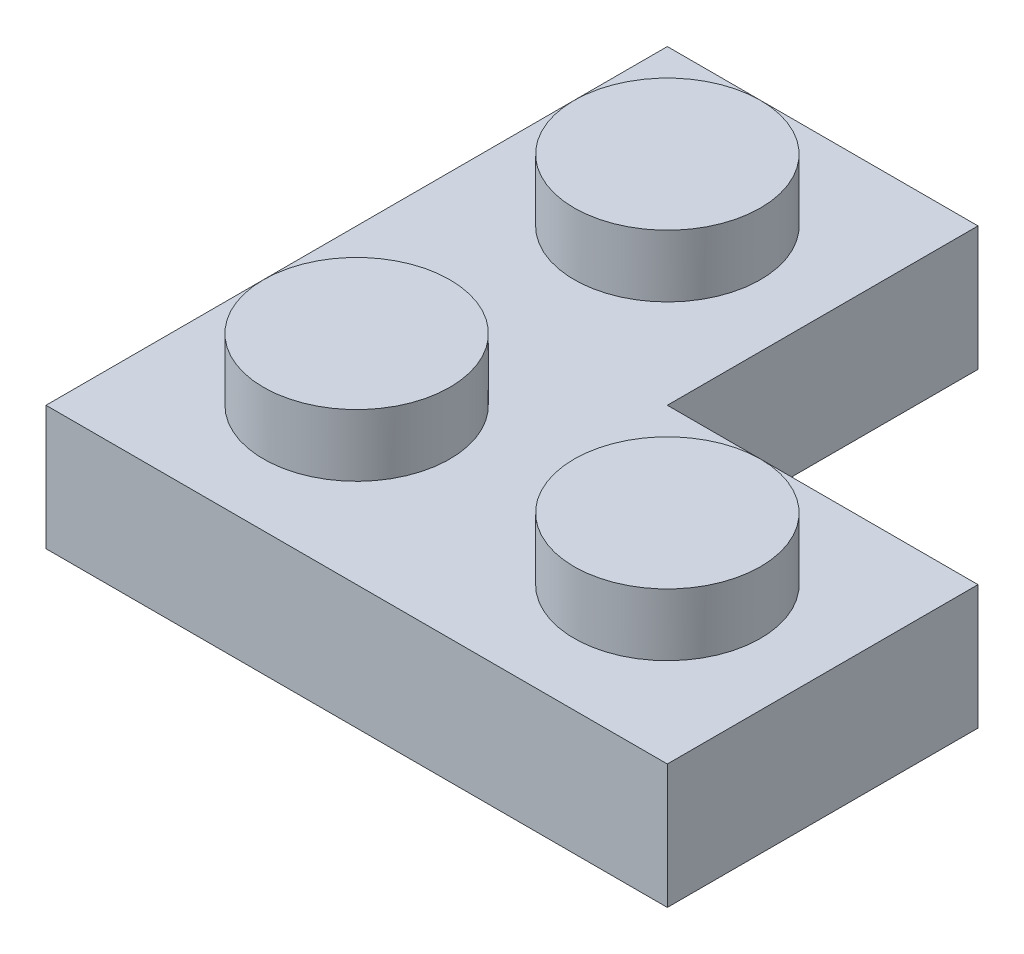
ISO-10303-21;
HEADER;
FILE_DESCRIPTION(('STEP AP214'),'2;1');
FILE_NAME('part.step','',(''),(''),'','','');
FILE_SCHEMA(('AUTOMOTIVE_DESIGN { 1 0 10303 214 1 1 1 1 }'));
ENDSEC;
DATA;
#1=APPLICATION_CONTEXT('core data for automotive mechanical design processes');
#2=APPLICATION_PROTOCOL_DEFINITION('international standard','automotive_design',2000,#1);
#3=PRODUCT_CONTEXT('',#1,'mechanical');
#4=PRODUCT('Part','Part','',(#3));
#5=PRODUCT_RELATED_PRODUCT_CATEGORY('part','',(#4));
#6=PRODUCT_DEFINITION_FORMATION('','',#4);
#7=PRODUCT_DEFINITION_CONTEXT('part definition',#1,'design');
#8=PRODUCT_DEFINITION('design','',#6,#7);
#9=PRODUCT_DEFINITION_SHAPE('','',#8);
#10=(LENGTH_UNIT() NAMED_UNIT(*) SI_UNIT(.MILLI.,.METRE.));
#11=(NAMED_UNIT(*) PLANE_ANGLE_UNIT() SI_UNIT($,.RADIAN.));
#12=(NAMED_UNIT(*) SI_UNIT($,.STERADIAN.) SOLID_ANGLE_UNIT());
#13=UNCERTAINTY_MEASURE_WITH_UNIT(LENGTH_MEASURE(1.E-05),#10,'distance_accuracy_value','');
#14=(GEOMETRIC_REPRESENTATION_CONTEXT(3) GLOBAL_UNCERTAINTY_ASSIGNED_CONTEXT((#13)) GLOBAL_UNIT_ASSIGNED_CONTEXT((#10,
#11,#12)) REPRESENTATION_CONTEXT('',''));
#15=CARTESIAN_POINT('',(0.,0.,0.));
#16=DIRECTION('',(0.,0.,1.));
#17=DIRECTION('',(1.,0.,0.));
#18=AXIS2_PLACEMENT_3D('',#15,#16,#17);
#19=CARTESIAN_POINT('',(0.,0.,0.));
#20=DIRECTION('',(0.,-1.,0.));
#21=DIRECTION('',(0.,0.,-1.));
#22=AXIS2_PLACEMENT_3D('',#19,#20,#21);
#23=PLANE('',#22);
#24=DIRECTION('',(1.,0.,0.));
#25=VECTOR('',#24,1.);
#26=CARTESIAN_POINT('',(16.,0.,0.));
#27=LINE('',#26,#25);
#28=CARTESIAN_POINT('',(0.,0.,0.));
#29=VERTEX_POINT('',#28);
#30=CARTESIAN_POINT('',(16.,0.,0.));
#31=VERTEX_POINT('',#30);
#32=EDGE_CURVE('E142',#29,#31,#27,.T.);
#33=ORIENTED_EDGE('',*,*,#32,.F.);
#34=DIRECTION('',(0.,0.,1.));
#35=VECTOR('',#34,1.);
#36=CARTESIAN_POINT('',(0.,0.,0.));
#37=LINE('',#36,#35);
#38=CARTESIAN_POINT('',(0.,0.,-16.));
#39=VERTEX_POINT('',#38);
#40=EDGE_CURVE('E91',#39,#29,#37,.T.);
#41=ORIENTED_EDGE('',*,*,#40,.F.);
#42=DIRECTION('',(-1.,0.,0.));
#43=VECTOR('',#42,1.);
#44=CARTESIAN_POINT('',(0.,0.,-16.));
#45=LINE('',#44,#43);
#46=CARTESIAN_POINT('',(8.,0.,-16.));
#47=VERTEX_POINT('',#46);
#48=EDGE_CURVE('E155',#47,#39,#45,.T.);
#49=ORIENTED_EDGE('',*,*,#48,.F.);
#50=DIRECTION('',(0.,0.,-1.));
#51=VECTOR('',#50,1.);
#52=CARTESIAN_POINT('',(8.,0.,-16.));
#53=LINE('',#52,#51);
#54=CARTESIAN_POINT('',(8.,0.,-8.));
#55=VERTEX_POINT('',#54);
#56=EDGE_CURVE('E127',#55,#47,#53,.T.);
#57=ORIENTED_EDGE('',*,*,#56,.F.);
#58=DIRECTION('',(-1.,0.,0.));
#59=VECTOR('',#58,1.);
#60=CARTESIAN_POINT('',(8.,0.,-8.));
#61=LINE('',#60,#59);
#62=CARTESIAN_POINT('',(16.,0.,-8.));
#63=VERTEX_POINT('',#62);
#64=EDGE_CURVE('E150',#63,#55,#61,.T.);
#65=ORIENTED_EDGE('',*,*,#64,.F.);
#66=DIRECTION('',(0.,0.,-1.));
#67=VECTOR('',#66,1.);
#68=CARTESIAN_POINT('',(16.,0.,-8.));
#69=LINE('',#68,#67);
#70=EDGE_CURVE('E146',#31,#63,#69,.T.);
#71=ORIENTED_EDGE('',*,*,#70,.F.);
#72=EDGE_LOOP('',(#33,#41,#49,#57,#65,#71));
#73=FACE_BOUND('',#72,.T.);
#74=DIRECTION('',(0.,0.,1.));
#75=VECTOR('',#74,1.);
#76=CARTESIAN_POINT('',(1.6,0.,0.));
#77=LINE('',#76,#75);
#78=CARTESIAN_POINT('',(1.6,0.,-14.4));
#79=VERTEX_POINT('',#78);
#80=CARTESIAN_POINT('',(1.6,0.,-1.6));
#81=VERTEX_POINT('',#80);
#82=EDGE_CURVE('E260',#79,#81,#77,.T.);
#83=ORIENTED_EDGE('',*,*,#82,.T.);
#84=DIRECTION('',(1.,0.,0.));
#85=VECTOR('',#84,1.);
#86=CARTESIAN_POINT('',(0.,0.,-1.6));
#87=LINE('',#86,#85);
#88=CARTESIAN_POINT('',(14.4,0.,-1.6));
#89=VERTEX_POINT('',#88);
#90=EDGE_CURVE('E249',#81,#89,#87,.T.);
#91=ORIENTED_EDGE('',*,*,#90,.T.);
#92=DIRECTION('',(0.,0.,-1.));
#93=VECTOR('',#92,1.);
#94=CARTESIAN_POINT('',(14.4,0.,0.));
#95=LINE('',#94,#93);
#96=CARTESIAN_POINT('',(14.4,0.,-6.4));
#97=VERTEX_POINT('',#96);
#98=EDGE_CURVE('E245',#89,#97,#95,.T.);
#99=ORIENTED_EDGE('',*,*,#98,.T.);
#100=DIRECTION('',(-1.,0.,0.));
#101=VECTOR('',#100,1.);
#102=CARTESIAN_POINT('',(0.,0.,-6.4));
#103=LINE('',#102,#101);
#104=CARTESIAN_POINT('',(6.4,0.,-6.4));
#105=VERTEX_POINT('',#104);
#106=EDGE_CURVE('E55',#97,#105,#103,.T.);
#107=ORIENTED_EDGE('',*,*,#106,.T.);
#108=DIRECTION('',(0.,0.,-1.));
#109=VECTOR('',#108,1.);
#110=CARTESIAN_POINT('',(6.4,0.,0.));
#111=LINE('',#110,#109);
#112=CARTESIAN_POINT('',(6.4,0.,-14.4));
#113=VERTEX_POINT('',#112);
#114=EDGE_CURVE('E252',#105,#113,#111,.T.);
#115=ORIENTED_EDGE('',*,*,#114,.T.);
#116=DIRECTION('',(-1.,0.,0.));
#117=VECTOR('',#116,1.);
#118=CARTESIAN_POINT('',(0.,0.,-14.4));
#119=LINE('',#118,#117);
#120=EDGE_CURVE('E256',#113,#79,#119,.T.);
#121=ORIENTED_EDGE('',*,*,#120,.T.);
#122=EDGE_LOOP('',(#83,#91,#99,#107,#115,#121));
#123=FACE_BOUND('',#122,.T.);
#124=ADVANCED_FACE('F39',(#73,#123),#23,.T.);
#125=CARTESIAN_POINT('',(16.,3.2,0.));
#126=DIRECTION('',(0.,0.,-1.));
#127=DIRECTION('',(-1.,0.,0.));
#128=AXIS2_PLACEMENT_3D('',#125,#126,#127);
#129=PLANE('',#128);
#130=ORIENTED_EDGE('',*,*,#32,.T.);
#131=DIRECTION('',(0.,-1.,0.));
#132=VECTOR('',#131,1.);
#133=CARTESIAN_POINT('',(16.,3.2,0.));
#134=LINE('',#133,#132);
#135=CARTESIAN_POINT('',(16.,3.2,0.));
#136=VERTEX_POINT('',#135);
#137=EDGE_CURVE('E171',#136,#31,#134,.T.);
#138=ORIENTED_EDGE('',*,*,#137,.F.);
#139=DIRECTION('',(1.,0.,0.));
#140=VECTOR('',#139,1.);
#141=CARTESIAN_POINT('',(16.,3.2,0.));
#142=LINE('',#141,#140);
#143=CARTESIAN_POINT('',(0.,3.2,0.));
#144=VERTEX_POINT('',#143);
#145=EDGE_CURVE('E160',#144,#136,#142,.T.);
#146=ORIENTED_EDGE('',*,*,#145,.F.);
#147=DIRECTION('',(0.,-1.,0.));
#148=VECTOR('',#147,1.);
#149=CARTESIAN_POINT('',(0.,3.2,0.));
#150=LINE('',#149,#148);
#151=EDGE_CURVE('E138',#144,#29,#150,.T.);
#152=ORIENTED_EDGE('',*,*,#151,.T.);
#153=EDGE_LOOP('',(#130,#138,#146,#152));
#154=FACE_BOUND('',#153,.T.);
#155=ADVANCED_FACE('F41',(#154),#129,.F.);
#156=CARTESIAN_POINT('',(16.,3.2,-8.));
#157=DIRECTION('',(-1.,0.,0.));
#158=DIRECTION('',(0.,0.,1.));
#159=AXIS2_PLACEMENT_3D('',#156,#157,#158);
#160=PLANE('',#159);
#161=ORIENTED_EDGE('',*,*,#70,.T.);
#162=DIRECTION('',(0.,-1.,0.));
#163=VECTOR('',#162,1.);
#164=CARTESIAN_POINT('',(16.,3.2,-8.));
#165=LINE('',#164,#163);
#166=CARTESIAN_POINT('',(16.,3.2,-8.));
#167=VERTEX_POINT('',#166);
#168=EDGE_CURVE('E167',#167,#63,#165,.T.);
#169=ORIENTED_EDGE('',*,*,#168,.F.);
#170=DIRECTION('',(0.,0.,-1.));
#171=VECTOR('',#170,1.);
#172=CARTESIAN_POINT('',(16.,3.2,-8.));
#173=LINE('',#172,#171);
#174=EDGE_CURVE('E100',#136,#167,#173,.T.);
#175=ORIENTED_EDGE('',*,*,#174,.F.);
#176=ORIENTED_EDGE('',*,*,#137,.T.);
#177=EDGE_LOOP('',(#161,#169,#175,#176));
#178=FACE_BOUND('',#177,.T.);
#179=ADVANCED_FACE('F207',(#178),#160,.F.);
#180=CARTESIAN_POINT('',(8.,3.2,-8.));
#181=DIRECTION('',(0.,0.,1.));
#182=DIRECTION('',(1.,0.,0.));
#183=AXIS2_PLACEMENT_3D('',#180,#181,#182);
#184=PLANE('',#183);
#185=ORIENTED_EDGE('',*,*,#64,.T.);
#186=DIRECTION('',(0.,-1.,0.));
#187=VECTOR('',#186,1.);
#188=CARTESIAN_POINT('',(8.,3.2,-8.));
#189=LINE('',#188,#187);
#190=CARTESIAN_POINT('',(8.,3.2,-8.));
#191=VERTEX_POINT('',#190);
#192=EDGE_CURVE('E131',#191,#55,#189,.T.);
#193=ORIENTED_EDGE('',*,*,#192,.F.);
#194=DIRECTION('',(-1.,0.,0.));
#195=VECTOR('',#194,1.);
#196=CARTESIAN_POINT('',(8.,3.2,-8.));
#197=LINE('',#196,#195);
#198=EDGE_CURVE('E117',#167,#191,#197,.T.);
#199=ORIENTED_EDGE('',*,*,#198,.F.);
#200=ORIENTED_EDGE('',*,*,#168,.T.);
#201=EDGE_LOOP('',(#185,#193,#199,#200));
#202=FACE_BOUND('',#201,.T.);
#203=ADVANCED_FACE('F218',(#202),#184,.F.);
#204=CARTESIAN_POINT('',(8.,3.2,-16.));
#205=DIRECTION('',(-1.,0.,0.));
#206=DIRECTION('',(0.,0.,1.));
#207=AXIS2_PLACEMENT_3D('',#204,#205,#206);
#208=PLANE('',#207);
#209=ORIENTED_EDGE('',*,*,#56,.T.);
#210=DIRECTION('',(0.,-1.,0.));
#211=VECTOR('',#210,1.);
#212=CARTESIAN_POINT('',(8.,3.2,-16.));
#213=LINE('',#212,#211);
#214=CARTESIAN_POINT('',(8.,3.2,-16.));
#215=VERTEX_POINT('',#214);
#216=EDGE_CURVE('E124',#215,#47,#213,.T.);
#217=ORIENTED_EDGE('',*,*,#216,.F.);
#218=DIRECTION('',(0.,0.,-1.));
#219=VECTOR('',#218,1.);
#220=CARTESIAN_POINT('',(8.,3.2,-16.));
#221=LINE('',#220,#219);
#222=EDGE_CURVE('E110',#191,#215,#221,.T.);
#223=ORIENTED_EDGE('',*,*,#222,.F.);
#224=ORIENTED_EDGE('',*,*,#192,.T.);
#225=EDGE_LOOP('',(#209,#217,#223,#224));
#226=FACE_BOUND('',#225,.T.);
#227=ADVANCED_FACE('F125',(#226),#208,.F.);
#228=CARTESIAN_POINT('',(0.,3.2,-16.));
#229=DIRECTION('',(0.,0.,1.));
#230=DIRECTION('',(1.,0.,0.));
#231=AXIS2_PLACEMENT_3D('',#228,#229,#230);
#232=PLANE('',#231);
#233=ORIENTED_EDGE('',*,*,#48,.T.);
#234=DIRECTION('',(0.,-1.,0.));
#235=VECTOR('',#234,1.);
#236=CARTESIAN_POINT('',(0.,3.2,-16.));
#237=LINE('',#236,#235);
#238=CARTESIAN_POINT('',(0.,3.2,-16.));
#239=VERTEX_POINT('',#238);
#240=EDGE_CURVE('E132',#239,#39,#237,.T.);
#241=ORIENTED_EDGE('',*,*,#240,.F.);
#242=DIRECTION('',(-1.,0.,0.));
#243=VECTOR('',#242,1.);
#244=CARTESIAN_POINT('',(0.,3.2,-16.));
#245=LINE('',#244,#243);
#246=EDGE_CURVE('E114',#215,#239,#245,.T.);
#247=ORIENTED_EDGE('',*,*,#246,.F.);
#248=ORIENTED_EDGE('',*,*,#216,.T.);
#249=EDGE_LOOP('',(#233,#241,#247,#248));
#250=FACE_BOUND('',#249,.T.);
#251=ADVANCED_FACE('F134',(#250),#232,.F.);
#252=CARTESIAN_POINT('',(0.,3.2,0.));
#253=DIRECTION('',(1.,0.,0.));
#254=DIRECTION('',(0.,0.,-1.));
#255=AXIS2_PLACEMENT_3D('',#252,#253,#254);
#256=PLANE('',#255);
#257=ORIENTED_EDGE('',*,*,#40,.T.);
#258=ORIENTED_EDGE('',*,*,#151,.F.);
#259=DIRECTION('',(0.,0.,1.));
#260=VECTOR('',#259,1.);
#261=CARTESIAN_POINT('',(0.,3.2,0.));
#262=LINE('',#261,#260);
#263=EDGE_CURVE('E64',#239,#144,#262,.T.);
#264=ORIENTED_EDGE('',*,*,#263,.F.);
#265=ORIENTED_EDGE('',*,*,#240,.T.);
#266=EDGE_LOOP('',(#257,#258,#264,#265));
#267=FACE_BOUND('',#266,.T.);
#268=ADVANCED_FACE('F186',(#267),#256,.F.);
#269=CARTESIAN_POINT('',(0.,3.2,0.));
#270=DIRECTION('',(0.,-1.,0.));
#271=DIRECTION('',(0.,0.,-1.));
#272=AXIS2_PLACEMENT_3D('',#269,#270,#271);
#273=PLANE('',#272);
#274=CARTESIAN_POINT('',(12.,3.2,-4.));
#275=DIRECTION('',(0.,-1.,0.));
#276=DIRECTION('',(0.,0.,-1.));
#277=AXIS2_PLACEMENT_3D('',#274,#275,#276);
#278=CIRCLE('',#277,2.4);
#279=CARTESIAN_POINT('',(12.,3.2,-6.4));
#280=VERTEX_POINT('',#279);
#281=EDGE_CURVE('E11',#280,#280,#278,.F.);
#282=ORIENTED_EDGE('',*,*,#281,.F.);
#283=EDGE_LOOP('',(#282));
#284=FACE_BOUND('',#283,.T.);
#285=CARTESIAN_POINT('',(4.,3.2,-12.));
#286=DIRECTION('',(0.,-1.,0.));
#287=DIRECTION('',(0.,0.,-1.));
#288=AXIS2_PLACEMENT_3D('',#285,#286,#287);
#289=CIRCLE('',#288,2.4);
#290=CARTESIAN_POINT('',(4.,3.2,-14.4));
#291=VERTEX_POINT('',#290);
#292=EDGE_CURVE('E48',#291,#291,#289,.F.);
#293=ORIENTED_EDGE('',*,*,#292,.F.);
#294=EDGE_LOOP('',(#293));
#295=FACE_BOUND('',#294,.T.);
#296=CARTESIAN_POINT('',(4.,3.2,-4.));
#297=DIRECTION('',(0.,-1.,0.));
#298=DIRECTION('',(0.,0.,-1.));
#299=AXIS2_PLACEMENT_3D('',#296,#297,#298);
#300=CIRCLE('',#299,2.4);
#301=CARTESIAN_POINT('',(4.,3.2,-6.4));
#302=VERTEX_POINT('',#301);
#303=EDGE_CURVE('E174',#302,#302,#300,.F.);
#304=ORIENTED_EDGE('',*,*,#303,.F.);
#305=EDGE_LOOP('',(#304));
#306=FACE_BOUND('',#305,.T.);
#307=ORIENTED_EDGE('',*,*,#145,.T.);
#308=ORIENTED_EDGE('',*,*,#174,.T.);
#309=ORIENTED_EDGE('',*,*,#198,.T.);
#310=ORIENTED_EDGE('',*,*,#222,.T.);
#311=ORIENTED_EDGE('',*,*,#246,.T.);
#312=ORIENTED_EDGE('',*,*,#263,.T.);
#313=EDGE_LOOP('',(#307,#308,#309,#310,#311,#312));
#314=FACE_BOUND('',#313,.T.);
#315=ADVANCED_FACE('F112',(#284,#295,#306,#314),#273,.F.);
#316=CARTESIAN_POINT('',(4.,4.8,-4.));
#317=DIRECTION('',(0.,-1.,0.));
#318=DIRECTION('',(0.,0.,-1.));
#319=AXIS2_PLACEMENT_3D('',#316,#317,#318);
#320=CYLINDRICAL_SURFACE('',#319,2.4);
#321=CARTESIAN_POINT('',(4.,4.8,-4.));
#322=DIRECTION('',(0.,1.,0.));
#323=DIRECTION('',(0.,0.,1.));
#324=AXIS2_PLACEMENT_3D('',#321,#322,#323);
#325=CIRCLE('',#324,2.4);
#326=CARTESIAN_POINT('',(4.,4.8,-1.6));
#327=VERTEX_POINT('',#326);
#328=EDGE_CURVE('E147',#327,#327,#325,.T.);
#329=ORIENTED_EDGE('',*,*,#328,.F.);
#330=EDGE_LOOP('',(#329));
#331=FACE_BOUND('',#330,.T.);
#332=ORIENTED_EDGE('',*,*,#303,.T.);
#333=EDGE_LOOP('',(#332));
#334=FACE_BOUND('',#333,.T.);
#335=ADVANCED_FACE('F185',(#331,#334),#320,.T.);
#336=CARTESIAN_POINT('',(4.,4.8,-4.));
#337=DIRECTION('',(0.,1.,0.));
#338=DIRECTION('',(0.,0.,1.));
#339=AXIS2_PLACEMENT_3D('',#336,#337,#338);
#340=PLANE('',#339);
#341=ORIENTED_EDGE('',*,*,#328,.T.);
#342=EDGE_LOOP('',(#341));
#343=FACE_BOUND('',#342,.T.);
#344=ADVANCED_FACE('F192',(#343),#340,.T.);
#345=CARTESIAN_POINT('',(4.,4.8,-12.));
#346=DIRECTION('',(0.,-1.,0.));
#347=DIRECTION('',(0.,0.,-1.));
#348=AXIS2_PLACEMENT_3D('',#345,#346,#347);
#349=CYLINDRICAL_SURFACE('',#348,2.4);
#350=CARTESIAN_POINT('',(4.,4.8,-12.));
#351=DIRECTION('',(0.,1.,0.));
#352=DIRECTION('',(0.,0.,1.));
#353=AXIS2_PLACEMENT_3D('',#350,#351,#352);
#354=CIRCLE('',#353,2.4);
#355=CARTESIAN_POINT('',(4.,4.8,-9.6));
#356=VERTEX_POINT('',#355);
#357=EDGE_CURVE('E236',#356,#356,#354,.T.);
#358=ORIENTED_EDGE('',*,*,#357,.F.);
#359=EDGE_LOOP('',(#358));
#360=FACE_BOUND('',#359,.T.);
#361=ORIENTED_EDGE('',*,*,#292,.T.);
#362=EDGE_LOOP('',(#361));
#363=FACE_BOUND('',#362,.T.);
#364=ADVANCED_FACE('F181',(#360,#363),#349,.T.);
#365=CARTESIAN_POINT('',(4.,4.8,-12.));
#366=DIRECTION('',(0.,1.,0.));
#367=DIRECTION('',(0.,0.,1.));
#368=AXIS2_PLACEMENT_3D('',#365,#366,#367);
#369=PLANE('',#368);
#370=ORIENTED_EDGE('',*,*,#357,.T.);
#371=EDGE_LOOP('',(#370));
#372=FACE_BOUND('',#371,.T.);
#373=ADVANCED_FACE('F417',(#372),#369,.T.);
#374=CARTESIAN_POINT('',(12.,4.8,-4.));
#375=DIRECTION('',(0.,-1.,0.));
#376=DIRECTION('',(0.,0.,-1.));
#377=AXIS2_PLACEMENT_3D('',#374,#375,#376);
#378=CYLINDRICAL_SURFACE('',#377,2.4);
#379=CARTESIAN_POINT('',(12.,4.8,-4.));
#380=DIRECTION('',(0.,1.,0.));
#381=DIRECTION('',(0.,0.,1.));
#382=AXIS2_PLACEMENT_3D('',#379,#380,#381);
#383=CIRCLE('',#382,2.4);
#384=CARTESIAN_POINT('',(12.,4.8,-1.6));
#385=VERTEX_POINT('',#384);
#386=EDGE_CURVE('E240',#385,#385,#383,.T.);
#387=ORIENTED_EDGE('',*,*,#386,.F.);
#388=EDGE_LOOP('',(#387));
#389=FACE_BOUND('',#388,.T.);
#390=ORIENTED_EDGE('',*,*,#281,.T.);
#391=EDGE_LOOP('',(#390));
#392=FACE_BOUND('',#391,.T.);
#393=ADVANCED_FACE('F413',(#389,#392),#378,.T.);
#394=CARTESIAN_POINT('',(12.,4.8,-4.));
#395=DIRECTION('',(0.,1.,0.));
#396=DIRECTION('',(0.,0.,1.));
#397=AXIS2_PLACEMENT_3D('',#394,#395,#396);
#398=PLANE('',#397);
#399=ORIENTED_EDGE('',*,*,#386,.T.);
#400=EDGE_LOOP('',(#399));
#401=FACE_BOUND('',#400,.T.);
#402=ADVANCED_FACE('F410',(#401),#398,.T.);
#403=CARTESIAN_POINT('',(16.,3.2,-1.6));
#404=DIRECTION('',(0.,0.,-1.));
#405=DIRECTION('',(-1.,0.,0.));
#406=AXIS2_PLACEMENT_3D('',#403,#404,#405);
#407=PLANE('',#406);
#408=ORIENTED_EDGE('',*,*,#90,.F.);
#409=DIRECTION('',(0.,-1.,0.));
#410=VECTOR('',#409,1.);
#411=CARTESIAN_POINT('',(1.6,3.2,-1.6));
#412=LINE('',#411,#410);
#413=CARTESIAN_POINT('',(1.6,1.6,-1.6));
#414=VERTEX_POINT('',#413);
#415=EDGE_CURVE('E296',#414,#81,#412,.T.);
#416=ORIENTED_EDGE('',*,*,#415,.F.);
#417=DIRECTION('',(1.,0.,0.));
#418=VECTOR('',#417,1.);
#419=CARTESIAN_POINT('',(0.,1.6,-1.6));
#420=LINE('',#419,#418);
#421=CARTESIAN_POINT('',(14.4,1.6,-1.6));
#422=VERTEX_POINT('',#421);
#423=EDGE_CURVE('E264',#414,#422,#420,.T.);
#424=ORIENTED_EDGE('',*,*,#423,.T.);
#425=DIRECTION('',(0.,-1.,0.));
#426=VECTOR('',#425,1.);
#427=CARTESIAN_POINT('',(14.4,3.2,-1.6));
#428=LINE('',#427,#426);
#429=EDGE_CURVE('E285',#422,#89,#428,.T.);
#430=ORIENTED_EDGE('',*,*,#429,.T.);
#431=EDGE_LOOP('',(#408,#416,#424,#430));
#432=FACE_BOUND('',#431,.T.);
#433=ADVANCED_FACE('F338',(#432),#407,.T.);
#434=CARTESIAN_POINT('',(14.4,3.2,-8.));
#435=DIRECTION('',(-1.,0.,0.));
#436=DIRECTION('',(0.,0.,1.));
#437=AXIS2_PLACEMENT_3D('',#434,#435,#436);
#438=PLANE('',#437);
#439=ORIENTED_EDGE('',*,*,#98,.F.);
#440=ORIENTED_EDGE('',*,*,#429,.F.);
#441=DIRECTION('',(0.,0.,-1.));
#442=VECTOR('',#441,1.);
#443=CARTESIAN_POINT('',(14.4,1.6,0.));
#444=LINE('',#443,#442);
#445=CARTESIAN_POINT('',(14.4,1.6,-6.4));
#446=VERTEX_POINT('',#445);
#447=EDGE_CURVE('E318',#422,#446,#444,.T.);
#448=ORIENTED_EDGE('',*,*,#447,.T.);
#449=DIRECTION('',(0.,-1.,0.));
#450=VECTOR('',#449,1.);
#451=CARTESIAN_POINT('',(14.4,3.2,-6.4));
#452=LINE('',#451,#450);
#453=EDGE_CURVE('E321',#446,#97,#452,.T.);
#454=ORIENTED_EDGE('',*,*,#453,.T.);
#455=EDGE_LOOP('',(#439,#440,#448,#454));
#456=FACE_BOUND('',#455,.T.);
#457=ADVANCED_FACE('F447',(#456),#438,.T.);
#458=CARTESIAN_POINT('',(8.,3.2,-6.4));
#459=DIRECTION('',(0.,0.,1.));
#460=DIRECTION('',(1.,0.,0.));
#461=AXIS2_PLACEMENT_3D('',#458,#459,#460);
#462=PLANE('',#461);
#463=ORIENTED_EDGE('',*,*,#106,.F.);
#464=ORIENTED_EDGE('',*,*,#453,.F.);
#465=DIRECTION('',(-1.,0.,0.));
#466=VECTOR('',#465,1.);
#467=CARTESIAN_POINT('',(0.,1.6,-6.4));
#468=LINE('',#467,#466);
#469=CARTESIAN_POINT('',(6.4,1.6,-6.4));
#470=VERTEX_POINT('',#469);
#471=EDGE_CURVE('E310',#446,#470,#468,.T.);
#472=ORIENTED_EDGE('',*,*,#471,.T.);
#473=DIRECTION('',(0.,-1.,0.));
#474=VECTOR('',#473,1.);
#475=CARTESIAN_POINT('',(6.4,3.2,-6.4));
#476=LINE('',#475,#474);
#477=EDGE_CURVE('E314',#470,#105,#476,.T.);
#478=ORIENTED_EDGE('',*,*,#477,.T.);
#479=EDGE_LOOP('',(#463,#464,#472,#478));
#480=FACE_BOUND('',#479,.T.);
#481=ADVANCED_FACE('F362',(#480),#462,.T.);
#482=CARTESIAN_POINT('',(6.4,3.2,-16.));
#483=DIRECTION('',(-1.,0.,0.));
#484=DIRECTION('',(0.,0.,1.));
#485=AXIS2_PLACEMENT_3D('',#482,#483,#484);
#486=PLANE('',#485);
#487=ORIENTED_EDGE('',*,*,#114,.F.);
#488=ORIENTED_EDGE('',*,*,#477,.F.);
#489=DIRECTION('',(0.,0.,-1.));
#490=VECTOR('',#489,1.);
#491=CARTESIAN_POINT('',(6.4,1.6,0.));
#492=LINE('',#491,#490);
#493=CARTESIAN_POINT('',(6.4,1.6,-14.4));
#494=VERTEX_POINT('',#493);
#495=EDGE_CURVE('E301',#470,#494,#492,.T.);
#496=ORIENTED_EDGE('',*,*,#495,.T.);
#497=DIRECTION('',(0.,-1.,0.));
#498=VECTOR('',#497,1.);
#499=CARTESIAN_POINT('',(6.4,3.2,-14.4));
#500=LINE('',#499,#498);
#501=EDGE_CURVE('E306',#494,#113,#500,.T.);
#502=ORIENTED_EDGE('',*,*,#501,.T.);
#503=EDGE_LOOP('',(#487,#488,#496,#502));
#504=FACE_BOUND('',#503,.T.);
#505=ADVANCED_FACE('F367',(#504),#486,.T.);
#506=CARTESIAN_POINT('',(0.,3.2,-14.4));
#507=DIRECTION('',(0.,0.,1.));
#508=DIRECTION('',(1.,0.,0.));
#509=AXIS2_PLACEMENT_3D('',#506,#507,#508);
#510=PLANE('',#509);
#511=ORIENTED_EDGE('',*,*,#120,.F.);
#512=ORIENTED_EDGE('',*,*,#501,.F.);
#513=DIRECTION('',(-1.,0.,0.));
#514=VECTOR('',#513,1.);
#515=CARTESIAN_POINT('',(0.,1.6,-14.4));
#516=LINE('',#515,#514);
#517=CARTESIAN_POINT('',(1.6,1.6,-14.4));
#518=VERTEX_POINT('',#517);
#519=EDGE_CURVE('E297',#494,#518,#516,.T.);
#520=ORIENTED_EDGE('',*,*,#519,.T.);
#521=DIRECTION('',(0.,-1.,0.));
#522=VECTOR('',#521,1.);
#523=CARTESIAN_POINT('',(1.6,3.2,-14.4));
#524=LINE('',#523,#522);
#525=EDGE_CURVE('E302',#518,#79,#524,.T.);
#526=ORIENTED_EDGE('',*,*,#525,.T.);
#527=EDGE_LOOP('',(#511,#512,#520,#526));
#528=FACE_BOUND('',#527,.T.);
#529=ADVANCED_FACE('F371',(#528),#510,.T.);
#530=CARTESIAN_POINT('',(1.6,3.2,0.));
#531=DIRECTION('',(1.,0.,0.));
#532=DIRECTION('',(0.,0.,-1.));
#533=AXIS2_PLACEMENT_3D('',#530,#531,#532);
#534=PLANE('',#533);
#535=ORIENTED_EDGE('',*,*,#82,.F.);
#536=ORIENTED_EDGE('',*,*,#525,.F.);
#537=DIRECTION('',(0.,0.,1.));
#538=VECTOR('',#537,1.);
#539=CARTESIAN_POINT('',(1.6,1.6,0.));
#540=LINE('',#539,#538);
#541=EDGE_CURVE('E292',#518,#414,#540,.T.);
#542=ORIENTED_EDGE('',*,*,#541,.T.);
#543=ORIENTED_EDGE('',*,*,#415,.T.);
#544=EDGE_LOOP('',(#535,#536,#542,#543));
#545=FACE_BOUND('',#544,.T.);
#546=ADVANCED_FACE('F352',(#545),#534,.T.);
#547=CARTESIAN_POINT('',(0.,1.6,0.));
#548=DIRECTION('',(0.,-1.,0.));
#549=DIRECTION('',(0.,0.,-1.));
#550=AXIS2_PLACEMENT_3D('',#547,#548,#549);
#551=PLANE('',#550);
#552=CARTESIAN_POINT('',(12.,1.6,-4.));
#553=DIRECTION('',(0.,-1.,0.));
#554=DIRECTION('',(0.,0.,-1.));
#555=AXIS2_PLACEMENT_3D('',#552,#553,#554);
#556=CIRCLE('',#555,0.799999999999999);
#557=CARTESIAN_POINT('',(12.,1.6,-4.8));
#558=VERTEX_POINT('',#557);
#559=EDGE_CURVE('E244',#558,#558,#556,.F.);
#560=ORIENTED_EDGE('',*,*,#559,.T.);
#561=EDGE_LOOP('',(#560));
#562=FACE_BOUND('',#561,.T.);
#563=CARTESIAN_POINT('',(4.,1.6,-12.));
#564=DIRECTION('',(0.,-1.,0.));
#565=DIRECTION('',(0.,0.,-1.));
#566=AXIS2_PLACEMENT_3D('',#563,#564,#565);
#567=CIRCLE('',#566,0.799999999999999);
#568=CARTESIAN_POINT('',(4.,1.6,-12.8));
#569=VERTEX_POINT('',#568);
#570=EDGE_CURVE('E284',#569,#569,#567,.F.);
#571=ORIENTED_EDGE('',*,*,#570,.T.);
#572=EDGE_LOOP('',(#571));
#573=FACE_BOUND('',#572,.T.);
#574=CARTESIAN_POINT('',(4.,1.6,-4.));
#575=DIRECTION('',(0.,-1.,0.));
#576=DIRECTION('',(0.,0.,-1.));
#577=AXIS2_PLACEMENT_3D('',#574,#575,#576);
#578=CIRCLE('',#577,0.799999999999999);
#579=CARTESIAN_POINT('',(4.,1.6,-4.8));
#580=VERTEX_POINT('',#579);
#581=EDGE_CURVE('E280',#580,#580,#578,.F.);
#582=ORIENTED_EDGE('',*,*,#581,.T.);
#583=EDGE_LOOP('',(#582));
#584=FACE_BOUND('',#583,.T.);
#585=ORIENTED_EDGE('',*,*,#423,.F.);
#586=ORIENTED_EDGE('',*,*,#541,.F.);
#587=ORIENTED_EDGE('',*,*,#519,.F.);
#588=ORIENTED_EDGE('',*,*,#495,.F.);
#589=ORIENTED_EDGE('',*,*,#471,.F.);
#590=ORIENTED_EDGE('',*,*,#447,.F.);
#591=EDGE_LOOP('',(#585,#586,#587,#588,#589,#590));
#592=FACE_BOUND('',#591,.T.);
#593=ADVANCED_FACE('F378',(#562,#573,#584,#592),#551,.T.);
#594=CARTESIAN_POINT('',(4.,4.8,-4.));
#595=DIRECTION('',(0.,-1.,0.));
#596=DIRECTION('',(0.,0.,-1.));
#597=AXIS2_PLACEMENT_3D('',#594,#595,#596);
#598=CYLINDRICAL_SURFACE('',#597,0.799999999999999);
#599=CARTESIAN_POINT('',(4.,3.2,-4.));
#600=DIRECTION('',(0.,1.,0.));
#601=DIRECTION('',(0.,0.,1.));
#602=AXIS2_PLACEMENT_3D('',#599,#600,#601);
#603=CIRCLE('',#602,0.799999999999999);
#604=CARTESIAN_POINT('',(4.,3.2,-3.2));
#605=VERTEX_POINT('',#604);
#606=EDGE_CURVE('E268',#605,#605,#603,.T.);
#607=ORIENTED_EDGE('',*,*,#606,.T.);
#608=EDGE_LOOP('',(#607));
#609=FACE_BOUND('',#608,.T.);
#610=ORIENTED_EDGE('',*,*,#581,.F.);
#611=EDGE_LOOP('',(#610));
#612=FACE_BOUND('',#611,.T.);
#613=ADVANCED_FACE('F385',(#609,#612),#598,.F.);
#614=CARTESIAN_POINT('',(4.,3.2,-4.));
#615=DIRECTION('',(0.,1.,0.));
#616=DIRECTION('',(0.,0.,1.));
#617=AXIS2_PLACEMENT_3D('',#614,#615,#616);
#618=PLANE('',#617);
#619=ORIENTED_EDGE('',*,*,#606,.F.);
#620=EDGE_LOOP('',(#619));
#621=FACE_BOUND('',#620,.T.);
#622=ADVANCED_FACE('F389',(#621),#618,.F.);
#623=CARTESIAN_POINT('',(4.,4.8,-12.));
#624=DIRECTION('',(0.,-1.,0.));
#625=DIRECTION('',(0.,0.,-1.));
#626=AXIS2_PLACEMENT_3D('',#623,#624,#625);
#627=CYLINDRICAL_SURFACE('',#626,0.799999999999999);
#628=CARTESIAN_POINT('',(4.,3.2,-12.));
#629=DIRECTION('',(0.,1.,0.));
#630=DIRECTION('',(0.,0.,1.));
#631=AXIS2_PLACEMENT_3D('',#628,#629,#630);
#632=CIRCLE('',#631,0.799999999999999);
#633=CARTESIAN_POINT('',(4.,3.2,-11.2));
#634=VERTEX_POINT('',#633);
#635=EDGE_CURVE('E273',#634,#634,#632,.T.);
#636=ORIENTED_EDGE('',*,*,#635,.T.);
#637=EDGE_LOOP('',(#636));
#638=FACE_BOUND('',#637,.T.);
#639=ORIENTED_EDGE('',*,*,#570,.F.);
#640=EDGE_LOOP('',(#639));
#641=FACE_BOUND('',#640,.T.);
#642=ADVANCED_FACE('F393',(#638,#641),#627,.F.);
#643=CARTESIAN_POINT('',(4.,3.2,-12.));
#644=DIRECTION('',(0.,1.,0.));
#645=DIRECTION('',(0.,0.,1.));
#646=AXIS2_PLACEMENT_3D('',#643,#644,#645);
#647=PLANE('',#646);
#648=ORIENTED_EDGE('',*,*,#635,.F.);
#649=EDGE_LOOP('',(#648));
#650=FACE_BOUND('',#649,.T.);
#651=ADVANCED_FACE('F397',(#650),#647,.F.);
#652=CARTESIAN_POINT('',(12.,4.8,-4.));
#653=DIRECTION('',(0.,-1.,0.));
#654=DIRECTION('',(0.,0.,-1.));
#655=AXIS2_PLACEMENT_3D('',#652,#653,#654);
#656=CYLINDRICAL_SURFACE('',#655,0.799999999999999);
#657=CARTESIAN_POINT('',(12.,3.2,-4.));
#658=DIRECTION('',(0.,1.,0.));
#659=DIRECTION('',(0.,0.,1.));
#660=AXIS2_PLACEMENT_3D('',#657,#658,#659);
#661=CIRCLE('',#660,0.799999999999999);
#662=CARTESIAN_POINT('',(12.,3.2,-3.2));
#663=VERTEX_POINT('',#662);
#664=EDGE_CURVE('E269',#663,#663,#661,.T.);
#665=ORIENTED_EDGE('',*,*,#664,.T.);
#666=EDGE_LOOP('',(#665));
#667=FACE_BOUND('',#666,.T.);
#668=ORIENTED_EDGE('',*,*,#559,.F.);
#669=EDGE_LOOP('',(#668));
#670=FACE_BOUND('',#669,.T.);
#671=ADVANCED_FACE('F401',(#667,#670),#656,.F.);
#672=CARTESIAN_POINT('',(12.,3.2,-4.));
#673=DIRECTION('',(0.,1.,0.));
#674=DIRECTION('',(0.,0.,1.));
#675=AXIS2_PLACEMENT_3D('',#672,#673,#674);
#676=PLANE('',#675);
#677=ORIENTED_EDGE('',*,*,#664,.F.);
#678=EDGE_LOOP('',(#677));
#679=FACE_BOUND('',#678,.T.);
#680=ADVANCED_FACE('F405',(#679),#676,.F.);
#681=CLOSED_SHELL('',(#124,#155,#179,#203,#227,#251,#268,#315,#335,#344,#364,#373,#393,#402,
#433,#457,#481,#505,#529,#546,#593,#613,#622,#642,#651,#671,#680));
#682=MANIFOLD_SOLID_BREP('B2',#681);
#683=ADVANCED_BREP_SHAPE_REPRESENTATION('',(#18,#682),#14);
#684=SHAPE_DEFINITION_REPRESENTATION(#9,#683);
ENDSEC;
END-ISO-10303-21;
